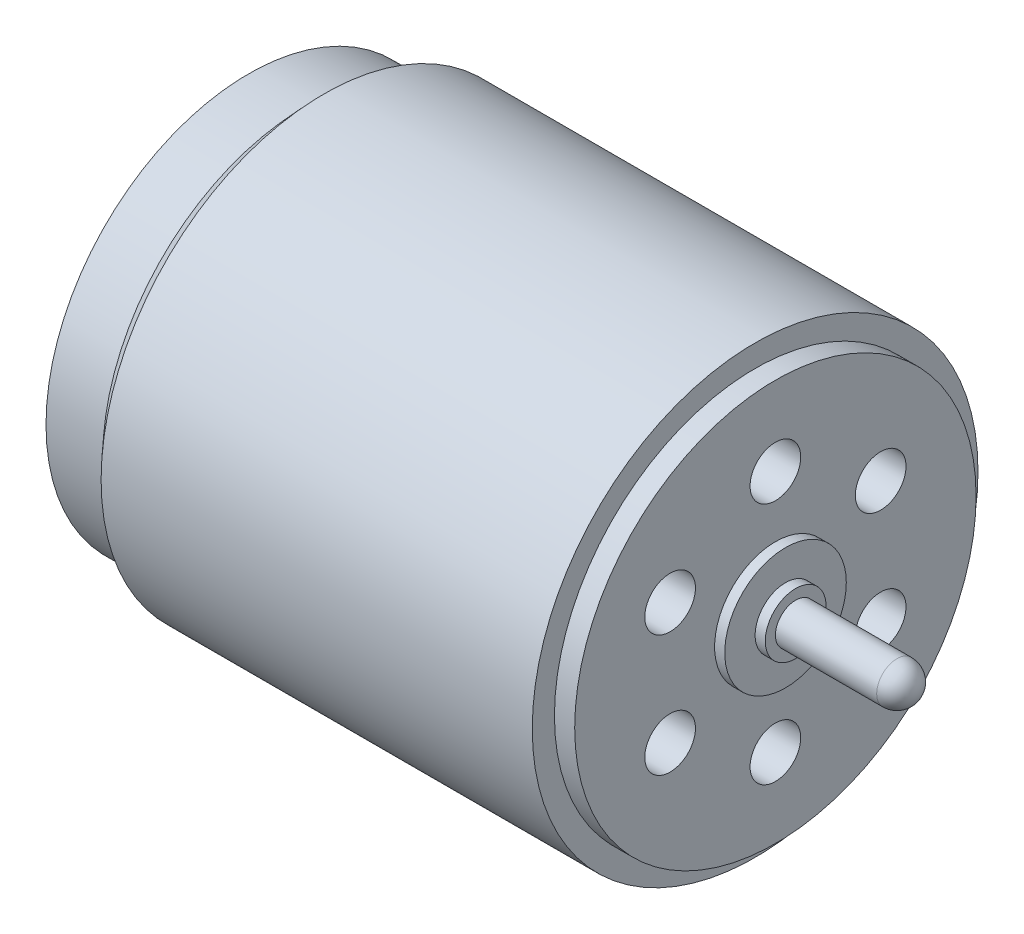
ISO-10303-21;
HEADER;
FILE_DESCRIPTION(('STEP AP214'),'2;1');
FILE_NAME('part.step','',(''),(''),'','','');
FILE_SCHEMA(('AUTOMOTIVE_DESIGN { 1 0 10303 214 1 1 1 1 }'));
ENDSEC;
DATA;
#1=APPLICATION_CONTEXT('core data for automotive mechanical design processes');
#2=APPLICATION_PROTOCOL_DEFINITION('international standard','automotive_design',2000,#1);
#3=PRODUCT_CONTEXT('',#1,'mechanical');
#4=PRODUCT('Part','Part','',(#3));
#5=PRODUCT_RELATED_PRODUCT_CATEGORY('part','',(#4));
#6=PRODUCT_DEFINITION_FORMATION('','',#4);
#7=PRODUCT_DEFINITION_CONTEXT('part definition',#1,'design');
#8=PRODUCT_DEFINITION('design','',#6,#7);
#9=PRODUCT_DEFINITION_SHAPE('','',#8);
#10=(LENGTH_UNIT() NAMED_UNIT(*) SI_UNIT(.MILLI.,.METRE.));
#11=(NAMED_UNIT(*) PLANE_ANGLE_UNIT() SI_UNIT($,.RADIAN.));
#12=(NAMED_UNIT(*) SI_UNIT($,.STERADIAN.) SOLID_ANGLE_UNIT());
#13=UNCERTAINTY_MEASURE_WITH_UNIT(LENGTH_MEASURE(1.E-05),#10,'distance_accuracy_value','');
#14=(GEOMETRIC_REPRESENTATION_CONTEXT(3) GLOBAL_UNCERTAINTY_ASSIGNED_CONTEXT((#13)) GLOBAL_UNIT_ASSIGNED_CONTEXT((#10,
#11,#12)) REPRESENTATION_CONTEXT('',''));
#15=CARTESIAN_POINT('',(0.,0.,0.));
#16=DIRECTION('',(0.,0.,1.));
#17=DIRECTION('',(1.,0.,0.));
#18=AXIS2_PLACEMENT_3D('',#15,#16,#17);
#19=CARTESIAN_POINT('',(26.5,0.,0.));
#20=DIRECTION('',(-1.,0.,0.));
#21=DIRECTION('',(0.,0.,1.));
#22=AXIS2_PLACEMENT_3D('',#19,#20,#21);
#23=CYLINDRICAL_SURFACE('',#22,3.);
#24=CARTESIAN_POINT('',(26.,0.,0.));
#25=DIRECTION('',(1.,0.,0.));
#26=DIRECTION('',(0.,0.,-1.));
#27=AXIS2_PLACEMENT_3D('',#24,#25,#26);
#28=CIRCLE('',#27,3.);
#29=CARTESIAN_POINT('',(26.,0.,-3.));
#30=VERTEX_POINT('',#29);
#31=EDGE_CURVE('E41',#30,#30,#28,.T.);
#32=ORIENTED_EDGE('',*,*,#31,.T.);
#33=EDGE_LOOP('',(#32));
#34=FACE_BOUND('',#33,.T.);
#35=CARTESIAN_POINT('',(26.5,0.,0.));
#36=DIRECTION('',(1.,0.,0.));
#37=DIRECTION('',(0.,0.,-1.));
#38=AXIS2_PLACEMENT_3D('',#35,#36,#37);
#39=CIRCLE('',#38,3.);
#40=CARTESIAN_POINT('',(26.5,0.,-3.));
#41=VERTEX_POINT('',#40);
#42=EDGE_CURVE('E58',#41,#41,#39,.T.);
#43=ORIENTED_EDGE('',*,*,#42,.F.);
#44=EDGE_LOOP('',(#43));
#45=FACE_BOUND('',#44,.T.);
#46=ADVANCED_FACE('F37',(#34,#45),#23,.T.);
#47=CARTESIAN_POINT('',(26.5,0.,0.));
#48=DIRECTION('',(1.,0.,0.));
#49=DIRECTION('',(0.,0.,-1.));
#50=AXIS2_PLACEMENT_3D('',#47,#48,#49);
#51=PLANE('',#50);
#52=CARTESIAN_POINT('',(26.5,0.,0.));
#53=DIRECTION('',(1.,0.,0.));
#54=DIRECTION('',(0.,0.,-1.));
#55=AXIS2_PLACEMENT_3D('',#52,#53,#54);
#56=CIRCLE('',#55,1.5);
#57=CARTESIAN_POINT('',(26.5,0.,-1.5));
#58=VERTEX_POINT('',#57);
#59=EDGE_CURVE('E51',#58,#58,#56,.T.);
#60=ORIENTED_EDGE('',*,*,#59,.F.);
#61=EDGE_LOOP('',(#60));
#62=FACE_BOUND('',#61,.T.);
#63=ORIENTED_EDGE('',*,*,#42,.T.);
#64=EDGE_LOOP('',(#63));
#65=FACE_BOUND('',#64,.T.);
#66=ADVANCED_FACE('F180',(#62,#65),#51,.T.);
#67=CARTESIAN_POINT('',(27.,0.,0.));
#68=DIRECTION('',(-1.,0.,0.));
#69=DIRECTION('',(0.,0.,1.));
#70=AXIS2_PLACEMENT_3D('',#67,#68,#69);
#71=CYLINDRICAL_SURFACE('',#70,1.5);
#72=CARTESIAN_POINT('',(27.,0.,0.));
#73=DIRECTION('',(1.,0.,0.));
#74=DIRECTION('',(0.,0.,-1.));
#75=AXIS2_PLACEMENT_3D('',#72,#73,#74);
#76=CIRCLE('',#75,1.5);
#77=CARTESIAN_POINT('',(27.,0.,-1.5));
#78=VERTEX_POINT('',#77);
#79=EDGE_CURVE('E62',#78,#78,#76,.T.);
#80=ORIENTED_EDGE('',*,*,#79,.F.);
#81=EDGE_LOOP('',(#80));
#82=FACE_BOUND('',#81,.T.);
#83=ORIENTED_EDGE('',*,*,#59,.T.);
#84=EDGE_LOOP('',(#83));
#85=FACE_BOUND('',#84,.T.);
#86=ADVANCED_FACE('F186',(#82,#85),#71,.T.);
#87=CARTESIAN_POINT('',(27.,0.,0.));
#88=DIRECTION('',(1.,0.,0.));
#89=DIRECTION('',(0.,0.,-1.));
#90=AXIS2_PLACEMENT_3D('',#87,#88,#89);
#91=PLANE('',#90);
#92=CARTESIAN_POINT('',(27.,0.,0.));
#93=DIRECTION('',(1.,0.,0.));
#94=DIRECTION('',(0.,0.,-1.));
#95=AXIS2_PLACEMENT_3D('',#92,#93,#94);
#96=CIRCLE('',#95,1.);
#97=CARTESIAN_POINT('',(27.,0.,-1.));
#98=VERTEX_POINT('',#97);
#99=EDGE_CURVE('E46',#98,#98,#96,.T.);
#100=ORIENTED_EDGE('',*,*,#99,.F.);
#101=EDGE_LOOP('',(#100));
#102=FACE_BOUND('',#101,.T.);
#103=ORIENTED_EDGE('',*,*,#79,.T.);
#104=EDGE_LOOP('',(#103));
#105=FACE_BOUND('',#104,.T.);
#106=ADVANCED_FACE('F217',(#102,#105),#91,.T.);
#107=CARTESIAN_POINT('',(33.,0.,0.));
#108=DIRECTION('',(-1.,0.,0.));
#109=DIRECTION('',(0.,0.,1.));
#110=AXIS2_PLACEMENT_3D('',#107,#108,#109);
#111=CYLINDRICAL_SURFACE('',#110,1.);
#112=CARTESIAN_POINT('',(32.,0.,0.));
#113=DIRECTION('',(-1.,0.,0.));
#114=DIRECTION('',(0.,0.,1.));
#115=AXIS2_PLACEMENT_3D('',#112,#113,#114);
#116=CIRCLE('',#115,1.);
#117=CARTESIAN_POINT('',(32.,0.,1.));
#118=VERTEX_POINT('',#117);
#119=EDGE_CURVE('E10',#118,#118,#116,.T.);
#120=ORIENTED_EDGE('',*,*,#119,.T.);
#121=EDGE_LOOP('',(#120));
#122=FACE_BOUND('',#121,.T.);
#123=ORIENTED_EDGE('',*,*,#99,.T.);
#124=EDGE_LOOP('',(#123));
#125=FACE_BOUND('',#124,.T.);
#126=ADVANCED_FACE('F214',(#122,#125),#111,.T.);
#127=CARTESIAN_POINT('',(32.,0.,0.));
#128=DIRECTION('',(1.,0.,0.));
#129=DIRECTION('',(0.,0.,-1.));
#130=AXIS2_PLACEMENT_3D('',#127,#128,#129);
#131=SPHERICAL_SURFACE('',#130,1.);
#132=ORIENTED_EDGE('',*,*,#119,.F.);
#133=EDGE_LOOP('',(#132));
#134=FACE_BOUND('',#133,.T.);
#135=ADVANCED_FACE('F39',(#134),#131,.T.);
#136=CARTESIAN_POINT('',(26.,0.,0.));
#137=DIRECTION('',(-1.,0.,0.));
#138=DIRECTION('',(0.,0.,1.));
#139=AXIS2_PLACEMENT_3D('',#136,#137,#138);
#140=CYLINDRICAL_SURFACE('',#139,9.90594675345909);
#141=CARTESIAN_POINT('',(26.,0.,0.));
#142=DIRECTION('',(1.,0.,0.));
#143=DIRECTION('',(0.,0.,-1.));
#144=AXIS2_PLACEMENT_3D('',#141,#142,#143);
#145=CIRCLE('',#144,9.90594675345909);
#146=CARTESIAN_POINT('',(26.,0.,-9.90594675345909));
#147=VERTEX_POINT('',#146);
#148=EDGE_CURVE('E73',#147,#147,#145,.T.);
#149=ORIENTED_EDGE('',*,*,#148,.F.);
#150=EDGE_LOOP('',(#149));
#151=FACE_BOUND('',#150,.T.);
#152=CARTESIAN_POINT('',(25.,0.,0.));
#153=DIRECTION('',(1.,0.,0.));
#154=DIRECTION('',(0.,0.,-1.));
#155=AXIS2_PLACEMENT_3D('',#152,#153,#154);
#156=CIRCLE('',#155,9.90594675345909);
#157=CARTESIAN_POINT('',(25.,0.,-9.90594675345909));
#158=VERTEX_POINT('',#157);
#159=EDGE_CURVE('E69',#158,#158,#156,.T.);
#160=ORIENTED_EDGE('',*,*,#159,.T.);
#161=EDGE_LOOP('',(#160));
#162=FACE_BOUND('',#161,.T.);
#163=ADVANCED_FACE('F151',(#151,#162),#140,.T.);
#164=CARTESIAN_POINT('',(26.,0.,0.));
#165=DIRECTION('',(1.,0.,0.));
#166=DIRECTION('',(0.,0.,-1.));
#167=AXIS2_PLACEMENT_3D('',#164,#165,#166);
#168=PLANE('',#167);
#169=CARTESIAN_POINT('',(26.,-3.0000000000003,5.19615242270612));
#170=DIRECTION('',(1.,0.,0.));
#171=DIRECTION('',(0.,0.,-1.));
#172=AXIS2_PLACEMENT_3D('',#169,#170,#171);
#173=CIRCLE('',#172,1.25000000000063);
#174=CARTESIAN_POINT('',(26.,-3.0000000000003,3.94615242270549));
#175=VERTEX_POINT('',#174);
#176=EDGE_CURVE('E98',#175,#175,#173,.T.);
#177=ORIENTED_EDGE('',*,*,#176,.F.);
#178=EDGE_LOOP('',(#177));
#179=FACE_BOUND('',#178,.T.);
#180=CARTESIAN_POINT('',(26.,-6.,-6.79916662091231E-13));
#181=DIRECTION('',(1.,0.,0.));
#182=DIRECTION('',(0.,0.,-1.));
#183=AXIS2_PLACEMENT_3D('',#180,#181,#182);
#184=CIRCLE('',#183,1.25000000000069);
#185=CARTESIAN_POINT('',(26.,-6.,-1.25000000000137));
#186=VERTEX_POINT('',#185);
#187=EDGE_CURVE('E106',#186,#186,#184,.T.);
#188=ORIENTED_EDGE('',*,*,#187,.F.);
#189=EDGE_LOOP('',(#188));
#190=FACE_BOUND('',#189,.T.);
#191=CARTESIAN_POINT('',(26.,-2.99999999999971,-5.19615242270714));
#192=DIRECTION('',(1.,0.,0.));
#193=DIRECTION('',(0.,0.,-1.));
#194=AXIS2_PLACEMENT_3D('',#191,#192,#193);
#195=CIRCLE('',#194,1.25000000000043);
#196=CARTESIAN_POINT('',(26.,-2.99999999999971,-6.44615242270757));
#197=VERTEX_POINT('',#196);
#198=EDGE_CURVE('E114',#197,#197,#195,.T.);
#199=ORIENTED_EDGE('',*,*,#198,.F.);
#200=EDGE_LOOP('',(#199));
#201=FACE_BOUND('',#200,.T.);
#202=CARTESIAN_POINT('',(26.,3.0000000000003,-5.1961524227068));
#203=DIRECTION('',(1.,0.,0.));
#204=DIRECTION('',(0.,0.,-1.));
#205=AXIS2_PLACEMENT_3D('',#202,#203,#204);
#206=CIRCLE('',#205,1.25000000000009);
#207=CARTESIAN_POINT('',(26.,3.0000000000003,-6.44615242270689));
#208=VERTEX_POINT('',#207);
#209=EDGE_CURVE('E122',#208,#208,#206,.T.);
#210=ORIENTED_EDGE('',*,*,#209,.F.);
#211=EDGE_LOOP('',(#210));
#212=FACE_BOUND('',#211,.T.);
#213=CARTESIAN_POINT('',(26.,6.,0.));
#214=DIRECTION('',(1.,0.,0.));
#215=DIRECTION('',(0.,0.,-1.));
#216=AXIS2_PLACEMENT_3D('',#213,#214,#215);
#217=CIRCLE('',#216,1.25);
#218=CARTESIAN_POINT('',(26.,6.,-1.25));
#219=VERTEX_POINT('',#218);
#220=EDGE_CURVE('E130',#219,#219,#217,.T.);
#221=ORIENTED_EDGE('',*,*,#220,.F.);
#222=EDGE_LOOP('',(#221));
#223=FACE_BOUND('',#222,.T.);
#224=CARTESIAN_POINT('',(26.,2.9999999999997,5.19615242270646));
#225=DIRECTION('',(1.,0.,0.));
#226=DIRECTION('',(0.,0.,-1.));
#227=AXIS2_PLACEMENT_3D('',#224,#225,#226);
#228=CIRCLE('',#227,1.25000000000032);
#229=CARTESIAN_POINT('',(26.,2.9999999999997,3.94615242270614));
#230=VERTEX_POINT('',#229);
#231=EDGE_CURVE('E90',#230,#230,#228,.T.);
#232=ORIENTED_EDGE('',*,*,#231,.F.);
#233=EDGE_LOOP('',(#232));
#234=FACE_BOUND('',#233,.T.);
#235=ORIENTED_EDGE('',*,*,#31,.F.);
#236=EDGE_LOOP('',(#235));
#237=FACE_BOUND('',#236,.T.);
#238=ORIENTED_EDGE('',*,*,#148,.T.);
#239=EDGE_LOOP('',(#238));
#240=FACE_BOUND('',#239,.T.);
#241=ADVANCED_FACE('F147',(#179,#190,#201,#212,#223,#234,#237,#240),#168,.T.);
#242=CARTESIAN_POINT('',(25.,0.,0.));
#243=DIRECTION('',(-1.,0.,0.));
#244=DIRECTION('',(0.,0.,1.));
#245=AXIS2_PLACEMENT_3D('',#242,#243,#244);
#246=CYLINDRICAL_SURFACE('',#245,11.);
#247=CARTESIAN_POINT('',(3.71935431006227,0.,0.));
#248=DIRECTION('',(-1.,0.,0.));
#249=DIRECTION('',(0.,0.,1.));
#250=AXIS2_PLACEMENT_3D('',#247,#248,#249);
#251=CIRCLE('',#250,11.);
#252=CARTESIAN_POINT('',(3.71935431006227,0.,11.));
#253=VERTEX_POINT('',#252);
#254=EDGE_CURVE('E85',#253,#253,#251,.T.);
#255=ORIENTED_EDGE('',*,*,#254,.F.);
#256=EDGE_LOOP('',(#255));
#257=FACE_BOUND('',#256,.T.);
#258=CARTESIAN_POINT('',(25.,0.,0.));
#259=DIRECTION('',(1.,0.,0.));
#260=DIRECTION('',(0.,0.,-1.));
#261=AXIS2_PLACEMENT_3D('',#258,#259,#260);
#262=CIRCLE('',#261,11.);
#263=CARTESIAN_POINT('',(25.,0.,-11.));
#264=VERTEX_POINT('',#263);
#265=EDGE_CURVE('E54',#264,#264,#262,.T.);
#266=ORIENTED_EDGE('',*,*,#265,.F.);
#267=EDGE_LOOP('',(#266));
#268=FACE_BOUND('',#267,.T.);
#269=ADVANCED_FACE('F150',(#257,#268),#246,.T.);
#270=CARTESIAN_POINT('',(25.,0.,0.));
#271=DIRECTION('',(1.,0.,0.));
#272=DIRECTION('',(0.,0.,-1.));
#273=AXIS2_PLACEMENT_3D('',#270,#271,#272);
#274=PLANE('',#273);
#275=ORIENTED_EDGE('',*,*,#159,.F.);
#276=EDGE_LOOP('',(#275));
#277=FACE_BOUND('',#276,.T.);
#278=ORIENTED_EDGE('',*,*,#265,.T.);
#279=EDGE_LOOP('',(#278));
#280=FACE_BOUND('',#279,.T.);
#281=ADVANCED_FACE('F166',(#277,#280),#274,.T.);
#282=CARTESIAN_POINT('',(0.,0.,0.));
#283=DIRECTION('',(-1.,0.,0.));
#284=DIRECTION('',(0.,0.,1.));
#285=AXIS2_PLACEMENT_3D('',#282,#283,#284);
#286=CYLINDRICAL_SURFACE('',#285,10.);
#287=CARTESIAN_POINT('',(0.,0.,0.));
#288=DIRECTION('',(-1.,0.,0.));
#289=DIRECTION('',(0.,0.,1.));
#290=AXIS2_PLACEMENT_3D('',#287,#288,#289);
#291=CIRCLE('',#290,10.);
#292=CARTESIAN_POINT('',(0.,0.,10.));
#293=VERTEX_POINT('',#292);
#294=EDGE_CURVE('E74',#293,#293,#291,.T.);
#295=ORIENTED_EDGE('',*,*,#294,.F.);
#296=EDGE_LOOP('',(#295));
#297=FACE_BOUND('',#296,.T.);
#298=CARTESIAN_POINT('',(2.7987246424892,0.,0.));
#299=DIRECTION('',(-1.,0.,0.));
#300=DIRECTION('',(0.,0.,1.));
#301=AXIS2_PLACEMENT_3D('',#298,#299,#300);
#302=CIRCLE('',#301,10.);
#303=CARTESIAN_POINT('',(2.7987246424892,0.,10.));
#304=VERTEX_POINT('',#303);
#305=EDGE_CURVE('E81',#304,#304,#302,.T.);
#306=ORIENTED_EDGE('',*,*,#305,.T.);
#307=EDGE_LOOP('',(#306));
#308=FACE_BOUND('',#307,.T.);
#309=ADVANCED_FACE('F169',(#297,#308),#286,.T.);
#310=CARTESIAN_POINT('',(3.71935431006227,0.,0.));
#311=DIRECTION('',(1.,0.,0.));
#312=DIRECTION('',(0.,0.,-1.));
#313=AXIS2_PLACEMENT_3D('',#310,#311,#312);
#314=CONICAL_SURFACE('',#313,11.,0.826699825004075);
#315=ORIENTED_EDGE('',*,*,#305,.F.);
#316=EDGE_LOOP('',(#315));
#317=FACE_BOUND('',#316,.T.);
#318=ORIENTED_EDGE('',*,*,#254,.T.);
#319=EDGE_LOOP('',(#318));
#320=FACE_BOUND('',#319,.T.);
#321=ADVANCED_FACE('F194',(#317,#320),#314,.T.);
#322=CARTESIAN_POINT('',(0.,0.,0.));
#323=DIRECTION('',(1.,0.,0.));
#324=DIRECTION('',(0.,0.,-1.));
#325=AXIS2_PLACEMENT_3D('',#322,#323,#324);
#326=PLANE('',#325);
#327=ORIENTED_EDGE('',*,*,#294,.T.);
#328=EDGE_LOOP('',(#327));
#329=FACE_BOUND('',#328,.T.);
#330=ADVANCED_FACE('F191',(#329),#326,.F.);
#331=CARTESIAN_POINT('',(20.,2.9999999999997,5.19615242270646));
#332=DIRECTION('',(1.,0.,0.));
#333=DIRECTION('',(0.,0.,-1.));
#334=AXIS2_PLACEMENT_3D('',#331,#332,#333);
#335=CYLINDRICAL_SURFACE('',#334,1.25000000000032);
#336=CARTESIAN_POINT('',(20.,2.9999999999997,5.19615242270646));
#337=DIRECTION('',(1.,0.,0.));
#338=DIRECTION('',(0.,0.,-1.));
#339=AXIS2_PLACEMENT_3D('',#336,#337,#338);
#340=CIRCLE('',#339,1.25000000000032);
#341=CARTESIAN_POINT('',(20.,2.9999999999997,3.94615242270614));
#342=VERTEX_POINT('',#341);
#343=EDGE_CURVE('E89',#342,#342,#340,.T.);
#344=ORIENTED_EDGE('',*,*,#343,.F.);
#345=EDGE_LOOP('',(#344));
#346=FACE_BOUND('',#345,.T.);
#347=ORIENTED_EDGE('',*,*,#231,.T.);
#348=EDGE_LOOP('',(#347));
#349=FACE_BOUND('',#348,.T.);
#350=ADVANCED_FACE('F193',(#346,#349),#335,.F.);
#351=CARTESIAN_POINT('',(20.,2.9999999999997,5.19615242270646));
#352=DIRECTION('',(1.,0.,0.));
#353=DIRECTION('',(0.,0.,-1.));
#354=AXIS2_PLACEMENT_3D('',#351,#352,#353);
#355=PLANE('',#354);
#356=ORIENTED_EDGE('',*,*,#343,.T.);
#357=EDGE_LOOP('',(#356));
#358=FACE_BOUND('',#357,.T.);
#359=ADVANCED_FACE('F143',(#358),#355,.T.);
#360=CARTESIAN_POINT('',(20.,6.,0.));
#361=DIRECTION('',(1.,0.,0.));
#362=DIRECTION('',(0.,0.,-1.));
#363=AXIS2_PLACEMENT_3D('',#360,#361,#362);
#364=CYLINDRICAL_SURFACE('',#363,1.25);
#365=CARTESIAN_POINT('',(20.,6.,0.));
#366=DIRECTION('',(1.,0.,0.));
#367=DIRECTION('',(0.,0.,-1.));
#368=AXIS2_PLACEMENT_3D('',#365,#366,#367);
#369=CIRCLE('',#368,1.25);
#370=CARTESIAN_POINT('',(20.,6.,-1.25));
#371=VERTEX_POINT('',#370);
#372=EDGE_CURVE('E94',#371,#371,#369,.T.);
#373=ORIENTED_EDGE('',*,*,#372,.F.);
#374=EDGE_LOOP('',(#373));
#375=FACE_BOUND('',#374,.T.);
#376=ORIENTED_EDGE('',*,*,#220,.T.);
#377=EDGE_LOOP('',(#376));
#378=FACE_BOUND('',#377,.T.);
#379=ADVANCED_FACE('F140',(#375,#378),#364,.F.);
#380=CARTESIAN_POINT('',(20.,6.,0.));
#381=DIRECTION('',(1.,0.,0.));
#382=DIRECTION('',(0.,0.,-1.));
#383=AXIS2_PLACEMENT_3D('',#380,#381,#382);
#384=PLANE('',#383);
#385=ORIENTED_EDGE('',*,*,#372,.T.);
#386=EDGE_LOOP('',(#385));
#387=FACE_BOUND('',#386,.T.);
#388=ADVANCED_FACE('F138',(#387),#384,.T.);
#389=CARTESIAN_POINT('',(20.,3.0000000000003,-5.1961524227068));
#390=DIRECTION('',(1.,0.,0.));
#391=DIRECTION('',(0.,0.,-1.));
#392=AXIS2_PLACEMENT_3D('',#389,#390,#391);
#393=CYLINDRICAL_SURFACE('',#392,1.25000000000009);
#394=CARTESIAN_POINT('',(20.,3.0000000000003,-5.1961524227068));
#395=DIRECTION('',(1.,0.,0.));
#396=DIRECTION('',(0.,0.,-1.));
#397=AXIS2_PLACEMENT_3D('',#394,#395,#396);
#398=CIRCLE('',#397,1.25000000000009);
#399=CARTESIAN_POINT('',(20.,3.0000000000003,-6.44615242270689));
#400=VERTEX_POINT('',#399);
#401=EDGE_CURVE('E126',#400,#400,#398,.T.);
#402=ORIENTED_EDGE('',*,*,#401,.F.);
#403=EDGE_LOOP('',(#402));
#404=FACE_BOUND('',#403,.T.);
#405=ORIENTED_EDGE('',*,*,#209,.T.);
#406=EDGE_LOOP('',(#405));
#407=FACE_BOUND('',#406,.T.);
#408=ADVANCED_FACE('F291',(#404,#407),#393,.F.);
#409=CARTESIAN_POINT('',(20.,3.0000000000003,-5.1961524227068));
#410=DIRECTION('',(1.,0.,0.));
#411=DIRECTION('',(0.,0.,-1.));
#412=AXIS2_PLACEMENT_3D('',#409,#410,#411);
#413=PLANE('',#412);
#414=ORIENTED_EDGE('',*,*,#401,.T.);
#415=EDGE_LOOP('',(#414));
#416=FACE_BOUND('',#415,.T.);
#417=ADVANCED_FACE('F300',(#416),#413,.T.);
#418=CARTESIAN_POINT('',(20.,-2.99999999999971,-5.19615242270714));
#419=DIRECTION('',(1.,0.,0.));
#420=DIRECTION('',(0.,0.,-1.));
#421=AXIS2_PLACEMENT_3D('',#418,#419,#420);
#422=CYLINDRICAL_SURFACE('',#421,1.25000000000043);
#423=CARTESIAN_POINT('',(20.,-2.99999999999971,-5.19615242270714));
#424=DIRECTION('',(1.,0.,0.));
#425=DIRECTION('',(0.,0.,-1.));
#426=AXIS2_PLACEMENT_3D('',#423,#424,#425);
#427=CIRCLE('',#426,1.25000000000043);
#428=CARTESIAN_POINT('',(20.,-2.99999999999971,-6.44615242270757));
#429=VERTEX_POINT('',#428);
#430=EDGE_CURVE('E118',#429,#429,#427,.T.);
#431=ORIENTED_EDGE('',*,*,#430,.F.);
#432=EDGE_LOOP('',(#431));
#433=FACE_BOUND('',#432,.T.);
#434=ORIENTED_EDGE('',*,*,#198,.T.);
#435=EDGE_LOOP('',(#434));
#436=FACE_BOUND('',#435,.T.);
#437=ADVANCED_FACE('F311',(#433,#436),#422,.F.);
#438=CARTESIAN_POINT('',(20.,-2.99999999999971,-5.19615242270714));
#439=DIRECTION('',(1.,0.,0.));
#440=DIRECTION('',(0.,0.,-1.));
#441=AXIS2_PLACEMENT_3D('',#438,#439,#440);
#442=PLANE('',#441);
#443=ORIENTED_EDGE('',*,*,#430,.T.);
#444=EDGE_LOOP('',(#443));
#445=FACE_BOUND('',#444,.T.);
#446=ADVANCED_FACE('F321',(#445),#442,.T.);
#447=CARTESIAN_POINT('',(20.,-6.,-6.79916662091231E-13));
#448=DIRECTION('',(1.,0.,0.));
#449=DIRECTION('',(0.,0.,-1.));
#450=AXIS2_PLACEMENT_3D('',#447,#448,#449);
#451=CYLINDRICAL_SURFACE('',#450,1.25000000000069);
#452=CARTESIAN_POINT('',(20.,-6.,-6.79916662091231E-13));
#453=DIRECTION('',(1.,0.,0.));
#454=DIRECTION('',(0.,0.,-1.));
#455=AXIS2_PLACEMENT_3D('',#452,#453,#454);
#456=CIRCLE('',#455,1.25000000000069);
#457=CARTESIAN_POINT('',(20.,-6.,-1.25000000000137));
#458=VERTEX_POINT('',#457);
#459=EDGE_CURVE('E110',#458,#458,#456,.T.);
#460=ORIENTED_EDGE('',*,*,#459,.F.);
#461=EDGE_LOOP('',(#460));
#462=FACE_BOUND('',#461,.T.);
#463=ORIENTED_EDGE('',*,*,#187,.T.);
#464=EDGE_LOOP('',(#463));
#465=FACE_BOUND('',#464,.T.);
#466=ADVANCED_FACE('F332',(#462,#465),#451,.F.);
#467=CARTESIAN_POINT('',(20.,-6.,-6.79916662091231E-13));
#468=DIRECTION('',(1.,0.,0.));
#469=DIRECTION('',(0.,0.,-1.));
#470=AXIS2_PLACEMENT_3D('',#467,#468,#469);
#471=PLANE('',#470);
#472=ORIENTED_EDGE('',*,*,#459,.T.);
#473=EDGE_LOOP('',(#472));
#474=FACE_BOUND('',#473,.T.);
#475=ADVANCED_FACE('F342',(#474),#471,.T.);
#476=CARTESIAN_POINT('',(20.,-3.0000000000003,5.19615242270612));
#477=DIRECTION('',(1.,0.,0.));
#478=DIRECTION('',(0.,0.,-1.));
#479=AXIS2_PLACEMENT_3D('',#476,#477,#478);
#480=CYLINDRICAL_SURFACE('',#479,1.25000000000063);
#481=CARTESIAN_POINT('',(20.,-3.0000000000003,5.19615242270612));
#482=DIRECTION('',(1.,0.,0.));
#483=DIRECTION('',(0.,0.,-1.));
#484=AXIS2_PLACEMENT_3D('',#481,#482,#483);
#485=CIRCLE('',#484,1.25000000000063);
#486=CARTESIAN_POINT('',(20.,-3.0000000000003,3.94615242270549));
#487=VERTEX_POINT('',#486);
#488=EDGE_CURVE('E102',#487,#487,#485,.T.);
#489=ORIENTED_EDGE('',*,*,#488,.F.);
#490=EDGE_LOOP('',(#489));
#491=FACE_BOUND('',#490,.T.);
#492=ORIENTED_EDGE('',*,*,#176,.T.);
#493=EDGE_LOOP('',(#492));
#494=FACE_BOUND('',#493,.T.);
#495=ADVANCED_FACE('F353',(#491,#494),#480,.F.);
#496=CARTESIAN_POINT('',(20.,-3.0000000000003,5.19615242270612));
#497=DIRECTION('',(1.,0.,0.));
#498=DIRECTION('',(0.,0.,-1.));
#499=AXIS2_PLACEMENT_3D('',#496,#497,#498);
#500=PLANE('',#499);
#501=ORIENTED_EDGE('',*,*,#488,.T.);
#502=EDGE_LOOP('',(#501));
#503=FACE_BOUND('',#502,.T.);
#504=ADVANCED_FACE('F363',(#503),#500,.T.);
#505=CLOSED_SHELL('',(#46,#66,#86,#106,#126,#135,#163,#241,#269,#281,#309,#321,#330,#350,#359,
#379,#388,#408,#417,#437,#446,#466,#475,#495,#504));
#506=MANIFOLD_SOLID_BREP('B2',#505);
#507=ADVANCED_BREP_SHAPE_REPRESENTATION('',(#18,#506),#14);
#508=SHAPE_DEFINITION_REPRESENTATION(#9,#507);
ENDSEC;
END-ISO-10303-21;
